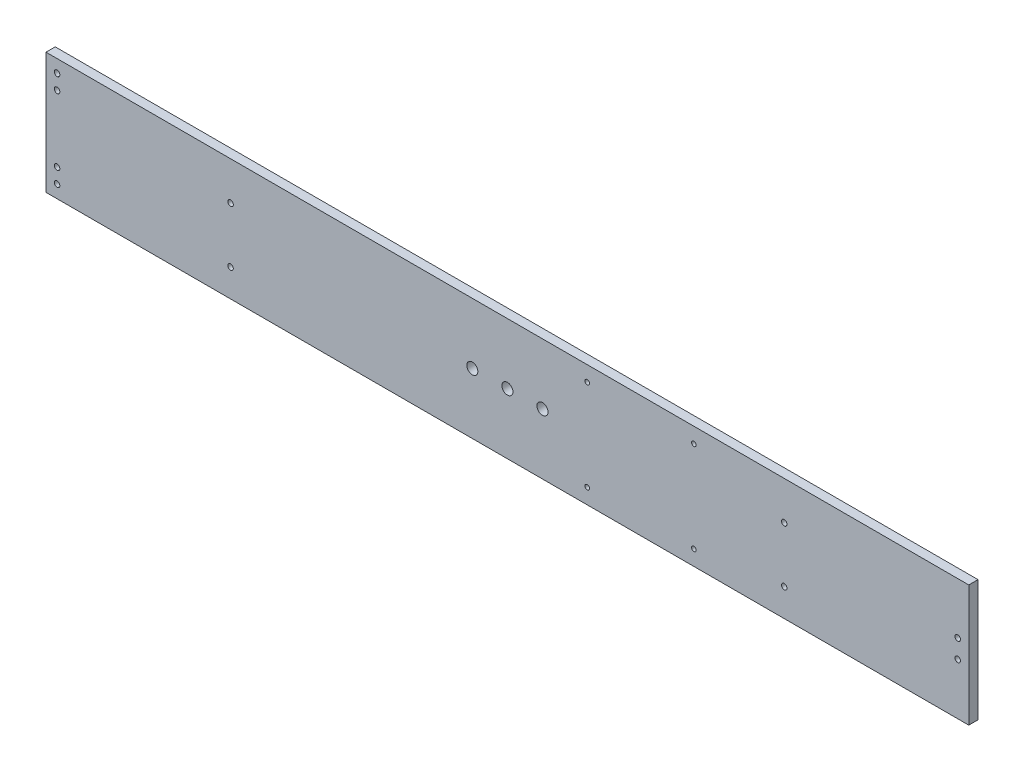
ISO-10303-21;
HEADER;
FILE_DESCRIPTION(('STEP AP214'),'2;1');
FILE_NAME('part.step','',(''),(''),'','','');
FILE_SCHEMA(('AUTOMOTIVE_DESIGN { 1 0 10303 214 1 1 1 1 }'));
ENDSEC;
DATA;
#1=APPLICATION_CONTEXT('core data for automotive mechanical design processes');
#2=APPLICATION_PROTOCOL_DEFINITION('international standard','automotive_design',2000,#1);
#3=PRODUCT_CONTEXT('',#1,'mechanical');
#4=PRODUCT('Part','Part','',(#3));
#5=PRODUCT_RELATED_PRODUCT_CATEGORY('part','',(#4));
#6=PRODUCT_DEFINITION_FORMATION('','',#4);
#7=PRODUCT_DEFINITION_CONTEXT('part definition',#1,'design');
#8=PRODUCT_DEFINITION('design','',#6,#7);
#9=PRODUCT_DEFINITION_SHAPE('','',#8);
#10=(LENGTH_UNIT() NAMED_UNIT(*) SI_UNIT(.MILLI.,.METRE.));
#11=(NAMED_UNIT(*) PLANE_ANGLE_UNIT() SI_UNIT($,.RADIAN.));
#12=(NAMED_UNIT(*) SI_UNIT($,.STERADIAN.) SOLID_ANGLE_UNIT());
#13=UNCERTAINTY_MEASURE_WITH_UNIT(LENGTH_MEASURE(1.E-05),#10,'distance_accuracy_value','');
#14=(GEOMETRIC_REPRESENTATION_CONTEXT(3) GLOBAL_UNCERTAINTY_ASSIGNED_CONTEXT((#13)) GLOBAL_UNIT_ASSIGNED_CONTEXT((#10,
#11,#12)) REPRESENTATION_CONTEXT('',''));
#15=CARTESIAN_POINT('',(0.,0.,0.));
#16=DIRECTION('',(0.,0.,1.));
#17=DIRECTION('',(1.,0.,0.));
#18=AXIS2_PLACEMENT_3D('',#15,#16,#17);
#19=CARTESIAN_POINT('',(0.,0.,5.));
#20=DIRECTION('',(0.,0.,1.));
#21=DIRECTION('',(1.,0.,0.));
#22=AXIS2_PLACEMENT_3D('',#19,#20,#21);
#23=PLANE('',#22);
#24=CARTESIAN_POINT('',(19.,0.,5.));
#25=DIRECTION('',(0.,0.,1.));
#26=DIRECTION('',(1.,0.,0.));
#27=AXIS2_PLACEMENT_3D('',#24,#25,#26);
#28=CIRCLE('',#27,3.);
#29=CARTESIAN_POINT('',(22.,0.,5.));
#30=VERTEX_POINT('',#29);
#31=EDGE_CURVE('E116',#30,#30,#28,.T.);
#32=ORIENTED_EDGE('',*,*,#31,.F.);
#33=EDGE_LOOP('',(#32));
#34=FACE_BOUND('',#33,.T.);
#35=CARTESIAN_POINT('',(-19.,0.,5.));
#36=DIRECTION('',(0.,0.,1.));
#37=DIRECTION('',(1.,0.,0.));
#38=AXIS2_PLACEMENT_3D('',#35,#36,#37);
#39=CIRCLE('',#38,3.);
#40=CARTESIAN_POINT('',(-16.,0.,5.));
#41=VERTEX_POINT('',#40);
#42=EDGE_CURVE('E122',#41,#41,#39,.T.);
#43=ORIENTED_EDGE('',*,*,#42,.F.);
#44=EDGE_LOOP('',(#43));
#45=FACE_BOUND('',#44,.T.);
#46=CARTESIAN_POINT('',(-244.,26.,5.));
#47=DIRECTION('',(0.,0.,1.));
#48=DIRECTION('',(1.,0.,0.));
#49=AXIS2_PLACEMENT_3D('',#46,#47,#48);
#50=CIRCLE('',#49,1.5);
#51=CARTESIAN_POINT('',(-242.5,26.,5.));
#52=VERTEX_POINT('',#51);
#53=EDGE_CURVE('E133',#52,#52,#50,.T.);
#54=ORIENTED_EDGE('',*,*,#53,.F.);
#55=EDGE_LOOP('',(#54));
#56=FACE_BOUND('',#55,.T.);
#57=CARTESIAN_POINT('',(-244.,18.,5.));
#58=DIRECTION('',(0.,0.,1.));
#59=DIRECTION('',(1.,0.,0.));
#60=AXIS2_PLACEMENT_3D('',#57,#58,#59);
#61=CIRCLE('',#60,1.5);
#62=CARTESIAN_POINT('',(-242.5,18.,5.));
#63=VERTEX_POINT('',#62);
#64=EDGE_CURVE('E139',#63,#63,#61,.T.);
#65=ORIENTED_EDGE('',*,*,#64,.F.);
#66=EDGE_LOOP('',(#65));
#67=FACE_BOUND('',#66,.T.);
#68=CARTESIAN_POINT('',(243.999999999999,-4.99999999999998,5.));
#69=DIRECTION('',(0.,0.,1.));
#70=DIRECTION('',(1.,0.,0.));
#71=AXIS2_PLACEMENT_3D('',#68,#69,#70);
#72=CIRCLE('',#71,1.5);
#73=CARTESIAN_POINT('',(245.499999999999,-4.99999999999998,5.));
#74=VERTEX_POINT('',#73);
#75=EDGE_CURVE('E151',#74,#74,#72,.F.);
#76=ORIENTED_EDGE('',*,*,#75,.T.);
#77=EDGE_LOOP('',(#76));
#78=FACE_BOUND('',#77,.T.);
#79=CARTESIAN_POINT('',(-244.,-18.,5.));
#80=DIRECTION('',(0.,0.,1.));
#81=DIRECTION('',(1.,0.,0.));
#82=AXIS2_PLACEMENT_3D('',#79,#80,#81);
#83=CIRCLE('',#82,1.5);
#84=CARTESIAN_POINT('',(-242.5,-18.,5.));
#85=VERTEX_POINT('',#84);
#86=EDGE_CURVE('E157',#85,#85,#83,.T.);
#87=ORIENTED_EDGE('',*,*,#86,.F.);
#88=EDGE_LOOP('',(#87));
#89=FACE_BOUND('',#88,.T.);
#90=CARTESIAN_POINT('',(-244.,-26.,5.));
#91=DIRECTION('',(0.,0.,1.));
#92=DIRECTION('',(1.,0.,0.));
#93=AXIS2_PLACEMENT_3D('',#90,#91,#92);
#94=CIRCLE('',#93,1.5);
#95=CARTESIAN_POINT('',(-242.5,-26.,5.));
#96=VERTEX_POINT('',#95);
#97=EDGE_CURVE('E120',#96,#96,#94,.T.);
#98=ORIENTED_EDGE('',*,*,#97,.F.);
#99=EDGE_LOOP('',(#98));
#100=FACE_BOUND('',#99,.T.);
#101=CARTESIAN_POINT('',(-150.,12.1,5.));
#102=DIRECTION('',(0.,0.,1.));
#103=DIRECTION('',(-1.,0.,0.));
#104=AXIS2_PLACEMENT_3D('',#101,#102,#103);
#105=CIRCLE('',#104,1.5);
#106=CARTESIAN_POINT('',(-151.5,12.1,5.));
#107=VERTEX_POINT('',#106);
#108=EDGE_CURVE('E178',#107,#107,#105,.T.);
#109=ORIENTED_EDGE('',*,*,#108,.F.);
#110=EDGE_LOOP('',(#109));
#111=FACE_BOUND('',#110,.T.);
#112=CARTESIAN_POINT('',(-150.,-17.9,5.));
#113=DIRECTION('',(0.,0.,1.));
#114=DIRECTION('',(-1.,0.,0.));
#115=AXIS2_PLACEMENT_3D('',#112,#113,#114);
#116=CIRCLE('',#115,1.5);
#117=CARTESIAN_POINT('',(-151.5,-17.9,5.));
#118=VERTEX_POINT('',#117);
#119=EDGE_CURVE('E172',#118,#118,#116,.T.);
#120=ORIENTED_EDGE('',*,*,#119,.F.);
#121=EDGE_LOOP('',(#120));
#122=FACE_BOUND('',#121,.T.);
#123=CARTESIAN_POINT('',(150.,-17.9,5.));
#124=DIRECTION('',(0.,0.,1.));
#125=DIRECTION('',(1.,0.,0.));
#126=AXIS2_PLACEMENT_3D('',#123,#124,#125);
#127=CIRCLE('',#126,1.5);
#128=CARTESIAN_POINT('',(151.5,-17.9,5.));
#129=VERTEX_POINT('',#128);
#130=EDGE_CURVE('E165',#129,#129,#127,.T.);
#131=ORIENTED_EDGE('',*,*,#130,.F.);
#132=EDGE_LOOP('',(#131));
#133=FACE_BOUND('',#132,.T.);
#134=CARTESIAN_POINT('',(150.,12.1,5.));
#135=DIRECTION('',(0.,0.,1.));
#136=DIRECTION('',(1.,0.,0.));
#137=AXIS2_PLACEMENT_3D('',#134,#135,#136);
#138=CIRCLE('',#137,1.5);
#139=CARTESIAN_POINT('',(151.5,12.1,5.));
#140=VERTEX_POINT('',#139);
#141=EDGE_CURVE('E168',#140,#140,#138,.T.);
#142=ORIENTED_EDGE('',*,*,#141,.F.);
#143=EDGE_LOOP('',(#142));
#144=FACE_BOUND('',#143,.T.);
#145=CARTESIAN_POINT('',(101.05,24.65,5.));
#146=DIRECTION('',(0.,0.,1.));
#147=DIRECTION('',(1.,0.,0.));
#148=AXIS2_PLACEMENT_3D('',#145,#146,#147);
#149=CIRCLE('',#148,1.25);
#150=CARTESIAN_POINT('',(102.3,24.65,5.));
#151=VERTEX_POINT('',#150);
#152=EDGE_CURVE('E195',#151,#151,#149,.T.);
#153=ORIENTED_EDGE('',*,*,#152,.F.);
#154=EDGE_LOOP('',(#153));
#155=FACE_BOUND('',#154,.T.);
#156=CARTESIAN_POINT('',(43.25,-24.65,5.));
#157=DIRECTION('',(0.,0.,1.));
#158=DIRECTION('',(1.,0.,0.));
#159=AXIS2_PLACEMENT_3D('',#156,#157,#158);
#160=CIRCLE('',#159,1.25);
#161=CARTESIAN_POINT('',(44.5,-24.65,5.));
#162=VERTEX_POINT('',#161);
#163=EDGE_CURVE('E207',#162,#162,#160,.T.);
#164=ORIENTED_EDGE('',*,*,#163,.F.);
#165=EDGE_LOOP('',(#164));
#166=FACE_BOUND('',#165,.T.);
#167=DIRECTION('',(0.,-1.,0.));
#168=VECTOR('',#167,1.);
#169=CARTESIAN_POINT('',(-250.,-32.9,5.));
#170=LINE('',#169,#168);
#171=CARTESIAN_POINT('',(-250.,32.9,5.));
#172=VERTEX_POINT('',#171);
#173=CARTESIAN_POINT('',(-250.,-32.9,5.));
#174=VERTEX_POINT('',#173);
#175=EDGE_CURVE('E93',#172,#174,#170,.T.);
#176=ORIENTED_EDGE('',*,*,#175,.T.);
#177=DIRECTION('',(1.,0.,0.));
#178=VECTOR('',#177,1.);
#179=CARTESIAN_POINT('',(250.,-32.9,5.));
#180=LINE('',#179,#178);
#181=CARTESIAN_POINT('',(250.,-32.9,5.));
#182=VERTEX_POINT('',#181);
#183=EDGE_CURVE('E88',#174,#182,#180,.T.);
#184=ORIENTED_EDGE('',*,*,#183,.T.);
#185=DIRECTION('',(0.,1.,0.));
#186=VECTOR('',#185,1.);
#187=CARTESIAN_POINT('',(250.,-32.9,5.));
#188=LINE('',#187,#186);
#189=CARTESIAN_POINT('',(250.,32.9,5.));
#190=VERTEX_POINT('',#189);
#191=EDGE_CURVE('E91',#182,#190,#188,.T.);
#192=ORIENTED_EDGE('',*,*,#191,.T.);
#193=DIRECTION('',(-1.,0.,0.));
#194=VECTOR('',#193,1.);
#195=CARTESIAN_POINT('',(250.,32.9,5.));
#196=LINE('',#195,#194);
#197=EDGE_CURVE('E58',#190,#172,#196,.T.);
#198=ORIENTED_EDGE('',*,*,#197,.T.);
#199=EDGE_LOOP('',(#176,#184,#192,#198));
#200=FACE_BOUND('',#199,.T.);
#201=CARTESIAN_POINT('',(43.25,24.65,5.));
#202=DIRECTION('',(0.,0.,1.));
#203=DIRECTION('',(1.,0.,0.));
#204=AXIS2_PLACEMENT_3D('',#201,#202,#203);
#205=CIRCLE('',#204,1.25);
#206=CARTESIAN_POINT('',(44.5,24.65,5.));
#207=VERTEX_POINT('',#206);
#208=EDGE_CURVE('E109',#207,#207,#205,.T.);
#209=ORIENTED_EDGE('',*,*,#208,.F.);
#210=EDGE_LOOP('',(#209));
#211=FACE_BOUND('',#210,.T.);
#212=CARTESIAN_POINT('',(101.05,-24.65,5.));
#213=DIRECTION('',(0.,0.,1.));
#214=DIRECTION('',(1.,0.,0.));
#215=AXIS2_PLACEMENT_3D('',#212,#213,#214);
#216=CIRCLE('',#215,1.25);
#217=CARTESIAN_POINT('',(102.3,-24.65,5.));
#218=VERTEX_POINT('',#217);
#219=EDGE_CURVE('E201',#218,#218,#216,.T.);
#220=ORIENTED_EDGE('',*,*,#219,.F.);
#221=EDGE_LOOP('',(#220));
#222=FACE_BOUND('',#221,.T.);
#223=CARTESIAN_POINT('',(0.,0.,5.));
#224=DIRECTION('',(0.,0.,1.));
#225=DIRECTION('',(1.,0.,0.));
#226=AXIS2_PLACEMENT_3D('',#223,#224,#225);
#227=CIRCLE('',#226,3.);
#228=CARTESIAN_POINT('',(2.99999999999997,0.,5.));
#229=VERTEX_POINT('',#228);
#230=EDGE_CURVE('E189',#229,#229,#227,.T.);
#231=ORIENTED_EDGE('',*,*,#230,.F.);
#232=EDGE_LOOP('',(#231));
#233=FACE_BOUND('',#232,.T.);
#234=CARTESIAN_POINT('',(243.999999999999,5.00000000000002,5.));
#235=DIRECTION('',(0.,0.,1.));
#236=DIRECTION('',(1.,0.,0.));
#237=AXIS2_PLACEMENT_3D('',#234,#235,#236);
#238=CIRCLE('',#237,1.5);
#239=CARTESIAN_POINT('',(245.499999999999,5.00000000000002,5.));
#240=VERTEX_POINT('',#239);
#241=EDGE_CURVE('E145',#240,#240,#238,.F.);
#242=ORIENTED_EDGE('',*,*,#241,.T.);
#243=EDGE_LOOP('',(#242));
#244=FACE_BOUND('',#243,.T.);
#245=ADVANCED_FACE('F39',(#34,#45,#56,#67,#78,#89,#100,#111,#122,#133,#144,#155,#166,#200,#211,
#222,#233,#244),#23,.T.);
#246=CARTESIAN_POINT('',(0.,0.,0.));
#247=DIRECTION('',(0.,0.,1.));
#248=DIRECTION('',(1.,0.,0.));
#249=AXIS2_PLACEMENT_3D('',#246,#247,#248);
#250=PLANE('',#249);
#251=CARTESIAN_POINT('',(19.,0.,0.));
#252=DIRECTION('',(0.,0.,1.));
#253=DIRECTION('',(1.,0.,0.));
#254=AXIS2_PLACEMENT_3D('',#251,#252,#253);
#255=CIRCLE('',#254,3.);
#256=CARTESIAN_POINT('',(22.,0.,0.));
#257=VERTEX_POINT('',#256);
#258=EDGE_CURVE('E43',#257,#257,#255,.T.);
#259=ORIENTED_EDGE('',*,*,#258,.T.);
#260=EDGE_LOOP('',(#259));
#261=FACE_BOUND('',#260,.T.);
#262=CARTESIAN_POINT('',(-19.,0.,0.));
#263=DIRECTION('',(0.,0.,1.));
#264=DIRECTION('',(1.,0.,0.));
#265=AXIS2_PLACEMENT_3D('',#262,#263,#264);
#266=CIRCLE('',#265,3.);
#267=CARTESIAN_POINT('',(-16.,0.,0.));
#268=VERTEX_POINT('',#267);
#269=EDGE_CURVE('E114',#268,#268,#266,.T.);
#270=ORIENTED_EDGE('',*,*,#269,.T.);
#271=EDGE_LOOP('',(#270));
#272=FACE_BOUND('',#271,.T.);
#273=CARTESIAN_POINT('',(-244.,26.,0.));
#274=DIRECTION('',(0.,0.,1.));
#275=DIRECTION('',(1.,0.,0.));
#276=AXIS2_PLACEMENT_3D('',#273,#274,#275);
#277=CIRCLE('',#276,1.5);
#278=CARTESIAN_POINT('',(-242.5,26.,0.));
#279=VERTEX_POINT('',#278);
#280=EDGE_CURVE('E129',#279,#279,#277,.T.);
#281=ORIENTED_EDGE('',*,*,#280,.T.);
#282=EDGE_LOOP('',(#281));
#283=FACE_BOUND('',#282,.T.);
#284=CARTESIAN_POINT('',(-244.,18.,0.));
#285=DIRECTION('',(0.,0.,1.));
#286=DIRECTION('',(1.,0.,0.));
#287=AXIS2_PLACEMENT_3D('',#284,#285,#286);
#288=CIRCLE('',#287,1.5);
#289=CARTESIAN_POINT('',(-242.5,18.,0.));
#290=VERTEX_POINT('',#289);
#291=EDGE_CURVE('E136',#290,#290,#288,.T.);
#292=ORIENTED_EDGE('',*,*,#291,.T.);
#293=EDGE_LOOP('',(#292));
#294=FACE_BOUND('',#293,.T.);
#295=CARTESIAN_POINT('',(-244.,-18.,0.));
#296=DIRECTION('',(0.,0.,1.));
#297=DIRECTION('',(1.,0.,0.));
#298=AXIS2_PLACEMENT_3D('',#295,#296,#297);
#299=CIRCLE('',#298,1.5);
#300=CARTESIAN_POINT('',(-242.5,-18.,0.));
#301=VERTEX_POINT('',#300);
#302=EDGE_CURVE('E154',#301,#301,#299,.T.);
#303=ORIENTED_EDGE('',*,*,#302,.T.);
#304=EDGE_LOOP('',(#303));
#305=FACE_BOUND('',#304,.T.);
#306=CARTESIAN_POINT('',(-244.,-26.,0.));
#307=DIRECTION('',(0.,0.,1.));
#308=DIRECTION('',(1.,0.,0.));
#309=AXIS2_PLACEMENT_3D('',#306,#307,#308);
#310=CIRCLE('',#309,1.5);
#311=CARTESIAN_POINT('',(-242.5,-26.,0.));
#312=VERTEX_POINT('',#311);
#313=EDGE_CURVE('E160',#312,#312,#310,.T.);
#314=ORIENTED_EDGE('',*,*,#313,.T.);
#315=EDGE_LOOP('',(#314));
#316=FACE_BOUND('',#315,.T.);
#317=CARTESIAN_POINT('',(-150.,12.1,0.));
#318=DIRECTION('',(0.,0.,1.));
#319=DIRECTION('',(-1.,0.,0.));
#320=AXIS2_PLACEMENT_3D('',#317,#318,#319);
#321=CIRCLE('',#320,1.5);
#322=CARTESIAN_POINT('',(-151.5,12.1,0.));
#323=VERTEX_POINT('',#322);
#324=EDGE_CURVE('E132',#323,#323,#321,.T.);
#325=ORIENTED_EDGE('',*,*,#324,.T.);
#326=EDGE_LOOP('',(#325));
#327=FACE_BOUND('',#326,.T.);
#328=CARTESIAN_POINT('',(-150.,-17.9,0.));
#329=DIRECTION('',(0.,0.,1.));
#330=DIRECTION('',(-1.,0.,0.));
#331=AXIS2_PLACEMENT_3D('',#328,#329,#330);
#332=CIRCLE('',#331,1.5);
#333=CARTESIAN_POINT('',(-151.5,-17.9,0.));
#334=VERTEX_POINT('',#333);
#335=EDGE_CURVE('E175',#334,#334,#332,.T.);
#336=ORIENTED_EDGE('',*,*,#335,.T.);
#337=EDGE_LOOP('',(#336));
#338=FACE_BOUND('',#337,.T.);
#339=CARTESIAN_POINT('',(150.,-17.9,0.));
#340=DIRECTION('',(0.,0.,1.));
#341=DIRECTION('',(1.,0.,0.));
#342=AXIS2_PLACEMENT_3D('',#339,#340,#341);
#343=CIRCLE('',#342,1.5);
#344=CARTESIAN_POINT('',(151.5,-17.9,0.));
#345=VERTEX_POINT('',#344);
#346=EDGE_CURVE('E169',#345,#345,#343,.T.);
#347=ORIENTED_EDGE('',*,*,#346,.T.);
#348=EDGE_LOOP('',(#347));
#349=FACE_BOUND('',#348,.T.);
#350=CARTESIAN_POINT('',(150.,12.1,0.));
#351=DIRECTION('',(0.,0.,1.));
#352=DIRECTION('',(1.,0.,0.));
#353=AXIS2_PLACEMENT_3D('',#350,#351,#352);
#354=CIRCLE('',#353,1.5);
#355=CARTESIAN_POINT('',(151.5,12.1,0.));
#356=VERTEX_POINT('',#355);
#357=EDGE_CURVE('E183',#356,#356,#354,.T.);
#358=ORIENTED_EDGE('',*,*,#357,.T.);
#359=EDGE_LOOP('',(#358));
#360=FACE_BOUND('',#359,.T.);
#361=DIRECTION('',(0.,-1.,0.));
#362=VECTOR('',#361,1.);
#363=CARTESIAN_POINT('',(-250.,-32.9,0.));
#364=LINE('',#363,#362);
#365=CARTESIAN_POINT('',(-250.,32.9,0.));
#366=VERTEX_POINT('',#365);
#367=CARTESIAN_POINT('',(-250.,-32.9,0.));
#368=VERTEX_POINT('',#367);
#369=EDGE_CURVE('E106',#366,#368,#364,.T.);
#370=ORIENTED_EDGE('',*,*,#369,.F.);
#371=DIRECTION('',(-1.,0.,0.));
#372=VECTOR('',#371,1.);
#373=CARTESIAN_POINT('',(250.,32.9,0.));
#374=LINE('',#373,#372);
#375=CARTESIAN_POINT('',(250.,32.9,0.));
#376=VERTEX_POINT('',#375);
#377=EDGE_CURVE('E81',#376,#366,#374,.T.);
#378=ORIENTED_EDGE('',*,*,#377,.F.);
#379=DIRECTION('',(0.,1.,0.));
#380=VECTOR('',#379,1.);
#381=CARTESIAN_POINT('',(250.,-32.9,0.));
#382=LINE('',#381,#380);
#383=CARTESIAN_POINT('',(250.,-32.9,0.));
#384=VERTEX_POINT('',#383);
#385=EDGE_CURVE('E75',#384,#376,#382,.T.);
#386=ORIENTED_EDGE('',*,*,#385,.F.);
#387=DIRECTION('',(1.,0.,0.));
#388=VECTOR('',#387,1.);
#389=CARTESIAN_POINT('',(250.,-32.9,0.));
#390=LINE('',#389,#388);
#391=EDGE_CURVE('E97',#368,#384,#390,.T.);
#392=ORIENTED_EDGE('',*,*,#391,.F.);
#393=EDGE_LOOP('',(#370,#378,#386,#392));
#394=FACE_BOUND('',#393,.T.);
#395=CARTESIAN_POINT('',(43.25,24.65,0.));
#396=DIRECTION('',(0.,0.,1.));
#397=DIRECTION('',(1.,0.,0.));
#398=AXIS2_PLACEMENT_3D('',#395,#396,#397);
#399=CIRCLE('',#398,1.25);
#400=CARTESIAN_POINT('',(44.5,24.65,0.));
#401=VERTEX_POINT('',#400);
#402=EDGE_CURVE('E210',#401,#401,#399,.T.);
#403=ORIENTED_EDGE('',*,*,#402,.T.);
#404=EDGE_LOOP('',(#403));
#405=FACE_BOUND('',#404,.T.);
#406=CARTESIAN_POINT('',(43.25,-24.65,0.));
#407=DIRECTION('',(0.,0.,1.));
#408=DIRECTION('',(1.,0.,0.));
#409=AXIS2_PLACEMENT_3D('',#406,#407,#408);
#410=CIRCLE('',#409,1.25);
#411=CARTESIAN_POINT('',(44.5,-24.65,0.));
#412=VERTEX_POINT('',#411);
#413=EDGE_CURVE('E204',#412,#412,#410,.T.);
#414=ORIENTED_EDGE('',*,*,#413,.T.);
#415=EDGE_LOOP('',(#414));
#416=FACE_BOUND('',#415,.T.);
#417=CARTESIAN_POINT('',(101.05,-24.65,0.));
#418=DIRECTION('',(0.,0.,1.));
#419=DIRECTION('',(1.,0.,0.));
#420=AXIS2_PLACEMENT_3D('',#417,#418,#419);
#421=CIRCLE('',#420,1.25);
#422=CARTESIAN_POINT('',(102.3,-24.65,0.));
#423=VERTEX_POINT('',#422);
#424=EDGE_CURVE('E198',#423,#423,#421,.T.);
#425=ORIENTED_EDGE('',*,*,#424,.T.);
#426=EDGE_LOOP('',(#425));
#427=FACE_BOUND('',#426,.T.);
#428=CARTESIAN_POINT('',(101.05,24.65,0.));
#429=DIRECTION('',(0.,0.,1.));
#430=DIRECTION('',(1.,0.,0.));
#431=AXIS2_PLACEMENT_3D('',#428,#429,#430);
#432=CIRCLE('',#431,1.25);
#433=CARTESIAN_POINT('',(102.3,24.65,0.));
#434=VERTEX_POINT('',#433);
#435=EDGE_CURVE('E192',#434,#434,#432,.T.);
#436=ORIENTED_EDGE('',*,*,#435,.T.);
#437=EDGE_LOOP('',(#436));
#438=FACE_BOUND('',#437,.T.);
#439=CARTESIAN_POINT('',(0.,0.,0.));
#440=DIRECTION('',(0.,0.,1.));
#441=DIRECTION('',(1.,0.,0.));
#442=AXIS2_PLACEMENT_3D('',#439,#440,#441);
#443=CIRCLE('',#442,3.);
#444=CARTESIAN_POINT('',(2.99999999999997,0.,0.));
#445=VERTEX_POINT('',#444);
#446=EDGE_CURVE('E186',#445,#445,#443,.T.);
#447=ORIENTED_EDGE('',*,*,#446,.T.);
#448=EDGE_LOOP('',(#447));
#449=FACE_BOUND('',#448,.T.);
#450=CARTESIAN_POINT('',(243.999999999999,-4.99999999999998,0.));
#451=DIRECTION('',(0.,0.,1.));
#452=DIRECTION('',(1.,0.,0.));
#453=AXIS2_PLACEMENT_3D('',#450,#451,#452);
#454=CIRCLE('',#453,1.5);
#455=CARTESIAN_POINT('',(245.499999999999,-4.99999999999998,0.));
#456=VERTEX_POINT('',#455);
#457=EDGE_CURVE('E148',#456,#456,#454,.F.);
#458=ORIENTED_EDGE('',*,*,#457,.F.);
#459=EDGE_LOOP('',(#458));
#460=FACE_BOUND('',#459,.T.);
#461=CARTESIAN_POINT('',(243.999999999999,5.00000000000002,0.));
#462=DIRECTION('',(0.,0.,1.));
#463=DIRECTION('',(1.,0.,0.));
#464=AXIS2_PLACEMENT_3D('',#461,#462,#463);
#465=CIRCLE('',#464,1.5);
#466=CARTESIAN_POINT('',(245.499999999999,5.00000000000002,0.));
#467=VERTEX_POINT('',#466);
#468=EDGE_CURVE('E142',#467,#467,#465,.F.);
#469=ORIENTED_EDGE('',*,*,#468,.F.);
#470=EDGE_LOOP('',(#469));
#471=FACE_BOUND('',#470,.T.);
#472=ADVANCED_FACE('F218',(#261,#272,#283,#294,#305,#316,#327,#338,#349,#360,#394,#405,#416,
#427,#438,#449,#460,#471),#250,.F.);
#473=CARTESIAN_POINT('',(-250.,-32.9,5.));
#474=DIRECTION('',(1.,0.,0.));
#475=DIRECTION('',(0.,0.,-1.));
#476=AXIS2_PLACEMENT_3D('',#473,#474,#475);
#477=PLANE('',#476);
#478=ORIENTED_EDGE('',*,*,#369,.T.);
#479=DIRECTION('',(0.,0.,-1.));
#480=VECTOR('',#479,1.);
#481=CARTESIAN_POINT('',(-250.,-32.9,5.));
#482=LINE('',#481,#480);
#483=EDGE_CURVE('E11',#174,#368,#482,.T.);
#484=ORIENTED_EDGE('',*,*,#483,.F.);
#485=ORIENTED_EDGE('',*,*,#175,.F.);
#486=DIRECTION('',(0.,0.,-1.));
#487=VECTOR('',#486,1.);
#488=CARTESIAN_POINT('',(-250.,32.9,5.));
#489=LINE('',#488,#487);
#490=EDGE_CURVE('E102',#172,#366,#489,.T.);
#491=ORIENTED_EDGE('',*,*,#490,.T.);
#492=EDGE_LOOP('',(#478,#484,#485,#491));
#493=FACE_BOUND('',#492,.T.);
#494=ADVANCED_FACE('F41',(#493),#477,.F.);
#495=CARTESIAN_POINT('',(250.,-32.9,5.));
#496=DIRECTION('',(0.,1.,0.));
#497=DIRECTION('',(-1.,0.,0.));
#498=AXIS2_PLACEMENT_3D('',#495,#496,#497);
#499=PLANE('',#498);
#500=ORIENTED_EDGE('',*,*,#391,.T.);
#501=DIRECTION('',(0.,0.,-1.));
#502=VECTOR('',#501,1.);
#503=CARTESIAN_POINT('',(250.,-32.9,5.));
#504=LINE('',#503,#502);
#505=EDGE_CURVE('E49',#182,#384,#504,.T.);
#506=ORIENTED_EDGE('',*,*,#505,.F.);
#507=ORIENTED_EDGE('',*,*,#183,.F.);
#508=ORIENTED_EDGE('',*,*,#483,.T.);
#509=EDGE_LOOP('',(#500,#506,#507,#508));
#510=FACE_BOUND('',#509,.T.);
#511=ADVANCED_FACE('F96',(#510),#499,.F.);
#512=CARTESIAN_POINT('',(250.,-32.9,5.));
#513=DIRECTION('',(-1.,0.,0.));
#514=DIRECTION('',(0.,0.,1.));
#515=AXIS2_PLACEMENT_3D('',#512,#513,#514);
#516=PLANE('',#515);
#517=ORIENTED_EDGE('',*,*,#385,.T.);
#518=DIRECTION('',(0.,0.,-1.));
#519=VECTOR('',#518,1.);
#520=CARTESIAN_POINT('',(250.,32.9,5.));
#521=LINE('',#520,#519);
#522=EDGE_CURVE('E98',#190,#376,#521,.T.);
#523=ORIENTED_EDGE('',*,*,#522,.F.);
#524=ORIENTED_EDGE('',*,*,#191,.F.);
#525=ORIENTED_EDGE('',*,*,#505,.T.);
#526=EDGE_LOOP('',(#517,#523,#524,#525));
#527=FACE_BOUND('',#526,.T.);
#528=ADVANCED_FACE('F100',(#527),#516,.F.);
#529=CARTESIAN_POINT('',(250.,32.9,5.));
#530=DIRECTION('',(0.,-1.,0.));
#531=DIRECTION('',(1.,0.,0.));
#532=AXIS2_PLACEMENT_3D('',#529,#530,#531);
#533=PLANE('',#532);
#534=ORIENTED_EDGE('',*,*,#377,.T.);
#535=ORIENTED_EDGE('',*,*,#490,.F.);
#536=ORIENTED_EDGE('',*,*,#197,.F.);
#537=ORIENTED_EDGE('',*,*,#522,.T.);
#538=EDGE_LOOP('',(#534,#535,#536,#537));
#539=FACE_BOUND('',#538,.T.);
#540=ADVANCED_FACE('F224',(#539),#533,.F.);
#541=CARTESIAN_POINT('',(43.25,24.65,5.));
#542=DIRECTION('',(0.,0.,-1.));
#543=DIRECTION('',(-1.,0.,0.));
#544=AXIS2_PLACEMENT_3D('',#541,#542,#543);
#545=CYLINDRICAL_SURFACE('',#544,1.25);
#546=ORIENTED_EDGE('',*,*,#208,.T.);
#547=EDGE_LOOP('',(#546));
#548=FACE_BOUND('',#547,.T.);
#549=ORIENTED_EDGE('',*,*,#402,.F.);
#550=EDGE_LOOP('',(#549));
#551=FACE_BOUND('',#550,.T.);
#552=ADVANCED_FACE('F221',(#548,#551),#545,.F.);
#553=CARTESIAN_POINT('',(43.25,-24.65,5.));
#554=DIRECTION('',(0.,0.,-1.));
#555=DIRECTION('',(-1.,0.,0.));
#556=AXIS2_PLACEMENT_3D('',#553,#554,#555);
#557=CYLINDRICAL_SURFACE('',#556,1.25);
#558=ORIENTED_EDGE('',*,*,#163,.T.);
#559=EDGE_LOOP('',(#558));
#560=FACE_BOUND('',#559,.T.);
#561=ORIENTED_EDGE('',*,*,#413,.F.);
#562=EDGE_LOOP('',(#561));
#563=FACE_BOUND('',#562,.T.);
#564=ADVANCED_FACE('F223',(#560,#563),#557,.F.);
#565=CARTESIAN_POINT('',(101.05,-24.65,5.));
#566=DIRECTION('',(0.,0.,-1.));
#567=DIRECTION('',(-1.,0.,0.));
#568=AXIS2_PLACEMENT_3D('',#565,#566,#567);
#569=CYLINDRICAL_SURFACE('',#568,1.25);
#570=ORIENTED_EDGE('',*,*,#219,.T.);
#571=EDGE_LOOP('',(#570));
#572=FACE_BOUND('',#571,.T.);
#573=ORIENTED_EDGE('',*,*,#424,.F.);
#574=EDGE_LOOP('',(#573));
#575=FACE_BOUND('',#574,.T.);
#576=ADVANCED_FACE('F231',(#572,#575),#569,.F.);
#577=CARTESIAN_POINT('',(101.05,24.65,5.));
#578=DIRECTION('',(0.,0.,-1.));
#579=DIRECTION('',(-1.,0.,0.));
#580=AXIS2_PLACEMENT_3D('',#577,#578,#579);
#581=CYLINDRICAL_SURFACE('',#580,1.25);
#582=ORIENTED_EDGE('',*,*,#152,.T.);
#583=EDGE_LOOP('',(#582));
#584=FACE_BOUND('',#583,.T.);
#585=ORIENTED_EDGE('',*,*,#435,.F.);
#586=EDGE_LOOP('',(#585));
#587=FACE_BOUND('',#586,.T.);
#588=ADVANCED_FACE('F292',(#584,#587),#581,.F.);
#589=CARTESIAN_POINT('',(0.,0.,5.));
#590=DIRECTION('',(0.,0.,-1.));
#591=DIRECTION('',(-1.,0.,0.));
#592=AXIS2_PLACEMENT_3D('',#589,#590,#591);
#593=CYLINDRICAL_SURFACE('',#592,3.);
#594=ORIENTED_EDGE('',*,*,#230,.T.);
#595=EDGE_LOOP('',(#594));
#596=FACE_BOUND('',#595,.T.);
#597=ORIENTED_EDGE('',*,*,#446,.F.);
#598=EDGE_LOOP('',(#597));
#599=FACE_BOUND('',#598,.T.);
#600=ADVANCED_FACE('F302',(#596,#599),#593,.F.);
#601=CARTESIAN_POINT('',(150.,12.1,0.));
#602=DIRECTION('',(0.,0.,1.));
#603=DIRECTION('',(1.,0.,0.));
#604=AXIS2_PLACEMENT_3D('',#601,#602,#603);
#605=CYLINDRICAL_SURFACE('',#604,1.5);
#606=ORIENTED_EDGE('',*,*,#357,.F.);
#607=EDGE_LOOP('',(#606));
#608=FACE_BOUND('',#607,.T.);
#609=ORIENTED_EDGE('',*,*,#141,.T.);
#610=EDGE_LOOP('',(#609));
#611=FACE_BOUND('',#610,.T.);
#612=ADVANCED_FACE('F312',(#608,#611),#605,.F.);
#613=CARTESIAN_POINT('',(150.,-17.9,0.));
#614=DIRECTION('',(0.,0.,1.));
#615=DIRECTION('',(1.,0.,0.));
#616=AXIS2_PLACEMENT_3D('',#613,#614,#615);
#617=CYLINDRICAL_SURFACE('',#616,1.5);
#618=ORIENTED_EDGE('',*,*,#346,.F.);
#619=EDGE_LOOP('',(#618));
#620=FACE_BOUND('',#619,.T.);
#621=ORIENTED_EDGE('',*,*,#130,.T.);
#622=EDGE_LOOP('',(#621));
#623=FACE_BOUND('',#622,.T.);
#624=ADVANCED_FACE('F322',(#620,#623),#617,.F.);
#625=CARTESIAN_POINT('',(-150.,-17.9,0.));
#626=DIRECTION('',(0.,0.,1.));
#627=DIRECTION('',(1.,0.,0.));
#628=AXIS2_PLACEMENT_3D('',#625,#626,#627);
#629=CYLINDRICAL_SURFACE('',#628,1.5);
#630=ORIENTED_EDGE('',*,*,#335,.F.);
#631=EDGE_LOOP('',(#630));
#632=FACE_BOUND('',#631,.T.);
#633=ORIENTED_EDGE('',*,*,#119,.T.);
#634=EDGE_LOOP('',(#633));
#635=FACE_BOUND('',#634,.T.);
#636=ADVANCED_FACE('F332',(#632,#635),#629,.F.);
#637=CARTESIAN_POINT('',(-150.,12.1,0.));
#638=DIRECTION('',(0.,0.,1.));
#639=DIRECTION('',(1.,0.,0.));
#640=AXIS2_PLACEMENT_3D('',#637,#638,#639);
#641=CYLINDRICAL_SURFACE('',#640,1.5);
#642=ORIENTED_EDGE('',*,*,#324,.F.);
#643=EDGE_LOOP('',(#642));
#644=FACE_BOUND('',#643,.T.);
#645=ORIENTED_EDGE('',*,*,#108,.T.);
#646=EDGE_LOOP('',(#645));
#647=FACE_BOUND('',#646,.T.);
#648=ADVANCED_FACE('F342',(#644,#647),#641,.F.);
#649=CARTESIAN_POINT('',(-244.,-26.,0.));
#650=DIRECTION('',(0.,0.,1.));
#651=DIRECTION('',(1.,0.,0.));
#652=AXIS2_PLACEMENT_3D('',#649,#650,#651);
#653=CYLINDRICAL_SURFACE('',#652,1.5);
#654=ORIENTED_EDGE('',*,*,#313,.F.);
#655=EDGE_LOOP('',(#654));
#656=FACE_BOUND('',#655,.T.);
#657=ORIENTED_EDGE('',*,*,#97,.T.);
#658=EDGE_LOOP('',(#657));
#659=FACE_BOUND('',#658,.T.);
#660=ADVANCED_FACE('F352',(#656,#659),#653,.F.);
#661=CARTESIAN_POINT('',(-244.,-18.,0.));
#662=DIRECTION('',(0.,0.,1.));
#663=DIRECTION('',(1.,0.,0.));
#664=AXIS2_PLACEMENT_3D('',#661,#662,#663);
#665=CYLINDRICAL_SURFACE('',#664,1.5);
#666=ORIENTED_EDGE('',*,*,#302,.F.);
#667=EDGE_LOOP('',(#666));
#668=FACE_BOUND('',#667,.T.);
#669=ORIENTED_EDGE('',*,*,#86,.T.);
#670=EDGE_LOOP('',(#669));
#671=FACE_BOUND('',#670,.T.);
#672=ADVANCED_FACE('F373',(#668,#671),#665,.F.);
#673=CARTESIAN_POINT('',(243.999999999999,-4.99999999999998,0.));
#674=DIRECTION('',(0.,0.,1.));
#675=DIRECTION('',(1.,0.,0.));
#676=AXIS2_PLACEMENT_3D('',#673,#674,#675);
#677=CYLINDRICAL_SURFACE('',#676,1.5);
#678=ORIENTED_EDGE('',*,*,#457,.T.);
#679=EDGE_LOOP('',(#678));
#680=FACE_BOUND('',#679,.T.);
#681=ORIENTED_EDGE('',*,*,#75,.F.);
#682=EDGE_LOOP('',(#681));
#683=FACE_BOUND('',#682,.T.);
#684=ADVANCED_FACE('F383',(#680,#683),#677,.F.);
#685=CARTESIAN_POINT('',(243.999999999999,5.00000000000002,0.));
#686=DIRECTION('',(0.,0.,1.));
#687=DIRECTION('',(1.,0.,0.));
#688=AXIS2_PLACEMENT_3D('',#685,#686,#687);
#689=CYLINDRICAL_SURFACE('',#688,1.5);
#690=ORIENTED_EDGE('',*,*,#468,.T.);
#691=EDGE_LOOP('',(#690));
#692=FACE_BOUND('',#691,.T.);
#693=ORIENTED_EDGE('',*,*,#241,.F.);
#694=EDGE_LOOP('',(#693));
#695=FACE_BOUND('',#694,.T.);
#696=ADVANCED_FACE('F393',(#692,#695),#689,.F.);
#697=CARTESIAN_POINT('',(-244.,18.,0.));
#698=DIRECTION('',(0.,0.,1.));
#699=DIRECTION('',(1.,0.,0.));
#700=AXIS2_PLACEMENT_3D('',#697,#698,#699);
#701=CYLINDRICAL_SURFACE('',#700,1.5);
#702=ORIENTED_EDGE('',*,*,#291,.F.);
#703=EDGE_LOOP('',(#702));
#704=FACE_BOUND('',#703,.T.);
#705=ORIENTED_EDGE('',*,*,#64,.T.);
#706=EDGE_LOOP('',(#705));
#707=FACE_BOUND('',#706,.T.);
#708=ADVANCED_FACE('F403',(#704,#707),#701,.F.);
#709=CARTESIAN_POINT('',(-244.,26.,0.));
#710=DIRECTION('',(0.,0.,1.));
#711=DIRECTION('',(1.,0.,0.));
#712=AXIS2_PLACEMENT_3D('',#709,#710,#711);
#713=CYLINDRICAL_SURFACE('',#712,1.5);
#714=ORIENTED_EDGE('',*,*,#280,.F.);
#715=EDGE_LOOP('',(#714));
#716=FACE_BOUND('',#715,.T.);
#717=ORIENTED_EDGE('',*,*,#53,.T.);
#718=EDGE_LOOP('',(#717));
#719=FACE_BOUND('',#718,.T.);
#720=ADVANCED_FACE('F413',(#716,#719),#713,.F.);
#721=CARTESIAN_POINT('',(-19.,0.,-5.));
#722=DIRECTION('',(0.,0.,1.));
#723=DIRECTION('',(1.,0.,0.));
#724=AXIS2_PLACEMENT_3D('',#721,#722,#723);
#725=CYLINDRICAL_SURFACE('',#724,3.);
#726=ORIENTED_EDGE('',*,*,#42,.T.);
#727=EDGE_LOOP('',(#726));
#728=FACE_BOUND('',#727,.T.);
#729=ORIENTED_EDGE('',*,*,#269,.F.);
#730=EDGE_LOOP('',(#729));
#731=FACE_BOUND('',#730,.T.);
#732=ADVANCED_FACE('F422',(#728,#731),#725,.F.);
#733=CARTESIAN_POINT('',(19.,0.,-5.));
#734=DIRECTION('',(0.,0.,1.));
#735=DIRECTION('',(1.,0.,0.));
#736=AXIS2_PLACEMENT_3D('',#733,#734,#735);
#737=CYLINDRICAL_SURFACE('',#736,3.);
#738=ORIENTED_EDGE('',*,*,#31,.T.);
#739=EDGE_LOOP('',(#738));
#740=FACE_BOUND('',#739,.T.);
#741=ORIENTED_EDGE('',*,*,#258,.F.);
#742=EDGE_LOOP('',(#741));
#743=FACE_BOUND('',#742,.T.);
#744=ADVANCED_FACE('F431',(#740,#743),#737,.F.);
#745=CLOSED_SHELL('',(#245,#472,#494,#511,#528,#540,#552,#564,#576,#588,#600,#612,#624,#636,
#648,#660,#672,#684,#696,#708,#720,#732,#744));
#746=MANIFOLD_SOLID_BREP('B2',#745);
#747=ADVANCED_BREP_SHAPE_REPRESENTATION('',(#18,#746),#14);
#748=SHAPE_DEFINITION_REPRESENTATION(#9,#747);
ENDSEC;
END-ISO-10303-21;
